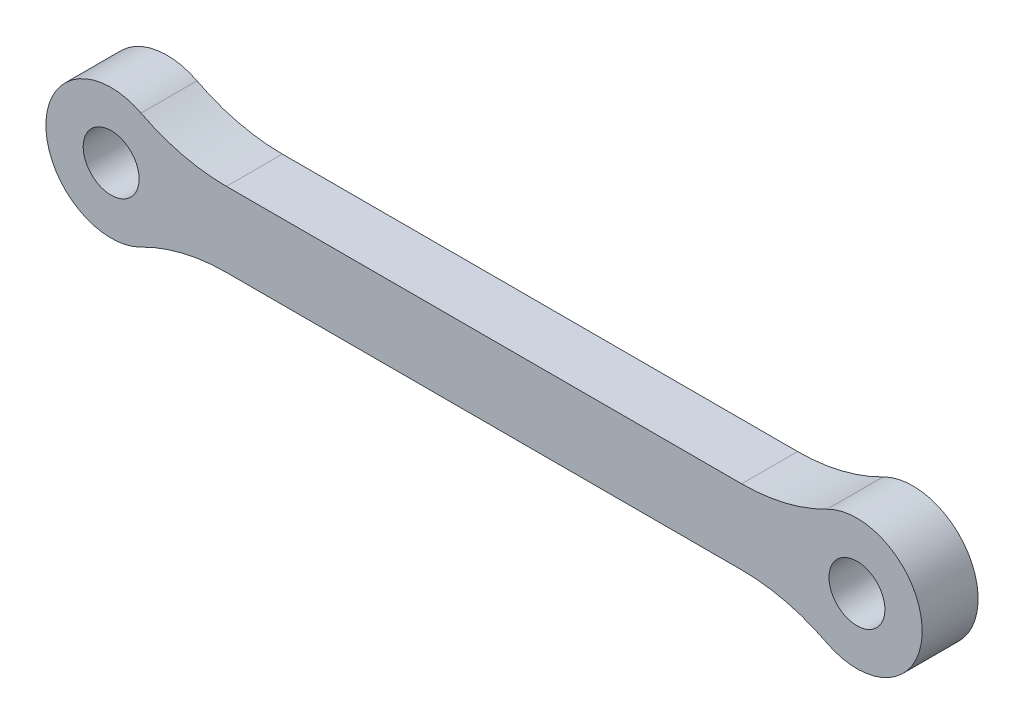
ISO-10303-21;
HEADER;
FILE_DESCRIPTION(('STEP AP214'),'2;1');
FILE_NAME('part.step','',(''),(''),'','','');
FILE_SCHEMA(('AUTOMOTIVE_DESIGN { 1 0 10303 214 1 1 1 1 }'));
ENDSEC;
DATA;
#1=APPLICATION_CONTEXT('core data for automotive mechanical design processes');
#2=APPLICATION_PROTOCOL_DEFINITION('international standard','automotive_design',2000,#1);
#3=PRODUCT_CONTEXT('',#1,'mechanical');
#4=PRODUCT('Part','Part','',(#3));
#5=PRODUCT_RELATED_PRODUCT_CATEGORY('part','',(#4));
#6=PRODUCT_DEFINITION_FORMATION('','',#4);
#7=PRODUCT_DEFINITION_CONTEXT('part definition',#1,'design');
#8=PRODUCT_DEFINITION('design','',#6,#7);
#9=PRODUCT_DEFINITION_SHAPE('','',#8);
#10=(LENGTH_UNIT() NAMED_UNIT(*) SI_UNIT(.MILLI.,.METRE.));
#11=(NAMED_UNIT(*) PLANE_ANGLE_UNIT() SI_UNIT($,.RADIAN.));
#12=(NAMED_UNIT(*) SI_UNIT($,.STERADIAN.) SOLID_ANGLE_UNIT());
#13=UNCERTAINTY_MEASURE_WITH_UNIT(LENGTH_MEASURE(1.E-05),#10,'distance_accuracy_value','');
#14=(GEOMETRIC_REPRESENTATION_CONTEXT(3) GLOBAL_UNCERTAINTY_ASSIGNED_CONTEXT((#13)) GLOBAL_UNIT_ASSIGNED_CONTEXT((#10,
#11,#12)) REPRESENTATION_CONTEXT('',''));
#15=CARTESIAN_POINT('',(0.,0.,0.));
#16=DIRECTION('',(0.,0.,1.));
#17=DIRECTION('',(1.,0.,0.));
#18=AXIS2_PLACEMENT_3D('',#15,#16,#17);
#19=CARTESIAN_POINT('',(-6.18465843842648,12.,3.));
#20=DIRECTION('',(0.,0.,1.));
#21=DIRECTION('',(1.,0.,0.));
#22=AXIS2_PLACEMENT_3D('',#19,#20,#21);
#23=PLANE('',#22);
#24=CARTESIAN_POINT('',(0.,0.,3.));
#25=DIRECTION('',(0.,0.,1.));
#26=DIRECTION('',(1.,0.,0.));
#27=AXIS2_PLACEMENT_3D('',#24,#25,#26);
#28=CIRCLE('',#27,1.5);
#29=CARTESIAN_POINT('',(1.5,0.,3.));
#30=VERTEX_POINT('',#29);
#31=EDGE_CURVE('E148',#30,#30,#28,.T.);
#32=ORIENTED_EDGE('',*,*,#31,.F.);
#33=EDGE_LOOP('',(#32));
#34=FACE_BOUND('',#33,.T.);
#35=CARTESIAN_POINT('',(-6.18465843842648,12.,3.));
#36=DIRECTION('',(0.,0.,-1.));
#37=DIRECTION('',(1.,0.,0.));
#38=AXIS2_PLACEMENT_3D('',#35,#36,#37);
#39=CIRCLE('',#38,10.);
#40=CARTESIAN_POINT('',(-1.60342996551798,3.11111111111111,3.));
#41=VERTEX_POINT('',#40);
#42=CARTESIAN_POINT('',(-6.18465843842648,2.,3.));
#43=VERTEX_POINT('',#42);
#44=EDGE_CURVE('E166',#41,#43,#39,.T.);
#45=ORIENTED_EDGE('',*,*,#44,.T.);
#46=DIRECTION('',(-1.,0.,0.));
#47=VECTOR('',#46,1.);
#48=CARTESIAN_POINT('',(-33.8153415615735,2.,3.));
#49=LINE('',#48,#47);
#50=CARTESIAN_POINT('',(-33.8153415615735,2.,3.));
#51=VERTEX_POINT('',#50);
#52=EDGE_CURVE('E102',#43,#51,#49,.T.);
#53=ORIENTED_EDGE('',*,*,#52,.T.);
#54=CARTESIAN_POINT('',(-33.8153415615735,12.,3.));
#55=DIRECTION('',(0.,0.,-1.));
#56=DIRECTION('',(-1.,0.,0.));
#57=AXIS2_PLACEMENT_3D('',#54,#55,#56);
#58=CIRCLE('',#57,10.);
#59=CARTESIAN_POINT('',(-38.396570034482,3.11111111111111,3.));
#60=VERTEX_POINT('',#59);
#61=EDGE_CURVE('E187',#51,#60,#58,.T.);
#62=ORIENTED_EDGE('',*,*,#61,.T.);
#63=CARTESIAN_POINT('',(-40.,0.,3.));
#64=DIRECTION('',(0.,0.,1.));
#65=DIRECTION('',(-1.,0.,0.));
#66=AXIS2_PLACEMENT_3D('',#63,#64,#65);
#67=CIRCLE('',#66,3.5);
#68=CARTESIAN_POINT('',(-38.396570034482,-3.11111111111112,3.));
#69=VERTEX_POINT('',#68);
#70=EDGE_CURVE('E201',#60,#69,#67,.T.);
#71=ORIENTED_EDGE('',*,*,#70,.T.);
#72=CARTESIAN_POINT('',(-33.8153415615735,-12.,3.));
#73=DIRECTION('',(0.,0.,-1.));
#74=DIRECTION('',(1.,0.,0.));
#75=AXIS2_PLACEMENT_3D('',#72,#73,#74);
#76=CIRCLE('',#75,10.);
#77=CARTESIAN_POINT('',(-33.8153415615735,-2.,3.));
#78=VERTEX_POINT('',#77);
#79=EDGE_CURVE('E121',#69,#78,#76,.T.);
#80=ORIENTED_EDGE('',*,*,#79,.T.);
#81=DIRECTION('',(1.,0.,0.));
#82=VECTOR('',#81,1.);
#83=CARTESIAN_POINT('',(-33.8153415615735,-2.,3.));
#84=LINE('',#83,#82);
#85=CARTESIAN_POINT('',(-6.18465843842648,-2.,3.));
#86=VERTEX_POINT('',#85);
#87=EDGE_CURVE('E115',#78,#86,#84,.T.);
#88=ORIENTED_EDGE('',*,*,#87,.T.);
#89=CARTESIAN_POINT('',(-6.18465843842648,-12.,3.));
#90=DIRECTION('',(0.,0.,-1.));
#91=DIRECTION('',(-1.,0.,0.));
#92=AXIS2_PLACEMENT_3D('',#89,#90,#91);
#93=CIRCLE('',#92,10.);
#94=CARTESIAN_POINT('',(-1.60342996551798,-3.11111111111111,3.));
#95=VERTEX_POINT('',#94);
#96=EDGE_CURVE('E119',#86,#95,#93,.T.);
#97=ORIENTED_EDGE('',*,*,#96,.T.);
#98=CARTESIAN_POINT('',(0.,0.,3.));
#99=DIRECTION('',(0.,0.,1.));
#100=DIRECTION('',(1.,0.,0.));
#101=AXIS2_PLACEMENT_3D('',#98,#99,#100);
#102=CIRCLE('',#101,3.5);
#103=EDGE_CURVE('E59',#95,#41,#102,.T.);
#104=ORIENTED_EDGE('',*,*,#103,.T.);
#105=EDGE_LOOP('',(#45,#53,#62,#71,#80,#88,#97,#104));
#106=FACE_BOUND('',#105,.T.);
#107=CARTESIAN_POINT('',(-40.,0.,3.));
#108=DIRECTION('',(0.,0.,1.));
#109=DIRECTION('',(-1.,0.,0.));
#110=AXIS2_PLACEMENT_3D('',#107,#108,#109);
#111=CIRCLE('',#110,1.5);
#112=CARTESIAN_POINT('',(-41.5,0.,3.));
#113=VERTEX_POINT('',#112);
#114=EDGE_CURVE('E215',#113,#113,#111,.T.);
#115=ORIENTED_EDGE('',*,*,#114,.F.);
#116=EDGE_LOOP('',(#115));
#117=FACE_BOUND('',#116,.T.);
#118=ADVANCED_FACE('F41',(#34,#106,#117),#23,.T.);
#119=CARTESIAN_POINT('',(-6.18465843842648,12.,0.));
#120=DIRECTION('',(0.,0.,1.));
#121=DIRECTION('',(1.,0.,0.));
#122=AXIS2_PLACEMENT_3D('',#119,#120,#121);
#123=PLANE('',#122);
#124=CARTESIAN_POINT('',(-6.18465843842648,12.,0.));
#125=DIRECTION('',(0.,0.,-1.));
#126=DIRECTION('',(1.,0.,0.));
#127=AXIS2_PLACEMENT_3D('',#124,#125,#126);
#128=CIRCLE('',#127,10.);
#129=CARTESIAN_POINT('',(-1.60342996551798,3.11111111111111,0.));
#130=VERTEX_POINT('',#129);
#131=CARTESIAN_POINT('',(-6.18465843842648,2.,0.));
#132=VERTEX_POINT('',#131);
#133=EDGE_CURVE('E143',#130,#132,#128,.T.);
#134=ORIENTED_EDGE('',*,*,#133,.F.);
#135=CARTESIAN_POINT('',(0.,0.,0.));
#136=DIRECTION('',(0.,0.,1.));
#137=DIRECTION('',(1.,0.,0.));
#138=AXIS2_PLACEMENT_3D('',#135,#136,#137);
#139=CIRCLE('',#138,3.5);
#140=CARTESIAN_POINT('',(-1.60342996551798,-3.11111111111111,0.));
#141=VERTEX_POINT('',#140);
#142=EDGE_CURVE('E94',#141,#130,#139,.T.);
#143=ORIENTED_EDGE('',*,*,#142,.F.);
#144=CARTESIAN_POINT('',(-6.18465843842648,-12.,0.));
#145=DIRECTION('',(0.,0.,-1.));
#146=DIRECTION('',(-1.,0.,0.));
#147=AXIS2_PLACEMENT_3D('',#144,#145,#146);
#148=CIRCLE('',#147,10.);
#149=CARTESIAN_POINT('',(-6.18465843842648,-2.,0.));
#150=VERTEX_POINT('',#149);
#151=EDGE_CURVE('E88',#150,#141,#148,.T.);
#152=ORIENTED_EDGE('',*,*,#151,.F.);
#153=DIRECTION('',(1.,0.,0.));
#154=VECTOR('',#153,1.);
#155=CARTESIAN_POINT('',(-33.8153415615735,-2.,0.));
#156=LINE('',#155,#154);
#157=CARTESIAN_POINT('',(-33.8153415615735,-2.,0.));
#158=VERTEX_POINT('',#157);
#159=EDGE_CURVE('E130',#158,#150,#156,.T.);
#160=ORIENTED_EDGE('',*,*,#159,.F.);
#161=CARTESIAN_POINT('',(-33.8153415615735,-12.,0.));
#162=DIRECTION('',(0.,0.,-1.));
#163=DIRECTION('',(1.,0.,0.));
#164=AXIS2_PLACEMENT_3D('',#161,#162,#163);
#165=CIRCLE('',#164,10.);
#166=CARTESIAN_POINT('',(-38.396570034482,-3.11111111111112,0.));
#167=VERTEX_POINT('',#166);
#168=EDGE_CURVE('E157',#167,#158,#165,.T.);
#169=ORIENTED_EDGE('',*,*,#168,.F.);
#170=CARTESIAN_POINT('',(-40.,0.,0.));
#171=DIRECTION('',(0.,0.,1.));
#172=DIRECTION('',(-1.,0.,0.));
#173=AXIS2_PLACEMENT_3D('',#170,#171,#172);
#174=CIRCLE('',#173,3.5);
#175=CARTESIAN_POINT('',(-38.396570034482,3.11111111111111,0.));
#176=VERTEX_POINT('',#175);
#177=EDGE_CURVE('E154',#176,#167,#174,.T.);
#178=ORIENTED_EDGE('',*,*,#177,.F.);
#179=CARTESIAN_POINT('',(-33.8153415615735,12.,0.));
#180=DIRECTION('',(0.,0.,-1.));
#181=DIRECTION('',(-1.,0.,0.));
#182=AXIS2_PLACEMENT_3D('',#179,#180,#181);
#183=CIRCLE('',#182,10.);
#184=CARTESIAN_POINT('',(-33.8153415615735,2.,0.));
#185=VERTEX_POINT('',#184);
#186=EDGE_CURVE('E151',#185,#176,#183,.T.);
#187=ORIENTED_EDGE('',*,*,#186,.F.);
#188=DIRECTION('',(-1.,0.,0.));
#189=VECTOR('',#188,1.);
#190=CARTESIAN_POINT('',(-33.8153415615735,2.,0.));
#191=LINE('',#190,#189);
#192=EDGE_CURVE('E147',#132,#185,#191,.T.);
#193=ORIENTED_EDGE('',*,*,#192,.F.);
#194=EDGE_LOOP('',(#134,#143,#152,#160,#169,#178,#187,#193));
#195=FACE_BOUND('',#194,.T.);
#196=CARTESIAN_POINT('',(0.,0.,0.));
#197=DIRECTION('',(0.,0.,1.));
#198=DIRECTION('',(1.,0.,0.));
#199=AXIS2_PLACEMENT_3D('',#196,#197,#198);
#200=CIRCLE('',#199,1.5);
#201=CARTESIAN_POINT('',(1.5,0.,0.));
#202=VERTEX_POINT('',#201);
#203=EDGE_CURVE('E211',#202,#202,#200,.T.);
#204=ORIENTED_EDGE('',*,*,#203,.T.);
#205=EDGE_LOOP('',(#204));
#206=FACE_BOUND('',#205,.T.);
#207=CARTESIAN_POINT('',(-40.,0.,0.));
#208=DIRECTION('',(0.,0.,1.));
#209=DIRECTION('',(-1.,0.,0.));
#210=AXIS2_PLACEMENT_3D('',#207,#208,#209);
#211=CIRCLE('',#210,1.5);
#212=CARTESIAN_POINT('',(-41.5,0.,0.));
#213=VERTEX_POINT('',#212);
#214=EDGE_CURVE('E219',#213,#213,#211,.T.);
#215=ORIENTED_EDGE('',*,*,#214,.T.);
#216=EDGE_LOOP('',(#215));
#217=FACE_BOUND('',#216,.T.);
#218=ADVANCED_FACE('F191',(#195,#206,#217),#123,.F.);
#219=CARTESIAN_POINT('',(-6.18465843842648,12.,3.));
#220=DIRECTION('',(0.,0.,-1.));
#221=DIRECTION('',(-1.,0.,0.));
#222=AXIS2_PLACEMENT_3D('',#219,#220,#221);
#223=CYLINDRICAL_SURFACE('',#222,10.);
#224=ORIENTED_EDGE('',*,*,#133,.T.);
#225=DIRECTION('',(0.,0.,-1.));
#226=VECTOR('',#225,1.);
#227=CARTESIAN_POINT('',(-6.18465843842648,2.,3.));
#228=LINE('',#227,#226);
#229=EDGE_CURVE('E11',#43,#132,#228,.T.);
#230=ORIENTED_EDGE('',*,*,#229,.F.);
#231=ORIENTED_EDGE('',*,*,#44,.F.);
#232=DIRECTION('',(0.,0.,-1.));
#233=VECTOR('',#232,1.);
#234=CARTESIAN_POINT('',(-1.60342996551798,3.11111111111111,3.));
#235=LINE('',#234,#233);
#236=EDGE_CURVE('E139',#41,#130,#235,.T.);
#237=ORIENTED_EDGE('',*,*,#236,.T.);
#238=EDGE_LOOP('',(#224,#230,#231,#237));
#239=FACE_BOUND('',#238,.T.);
#240=ADVANCED_FACE('F43',(#239),#223,.F.);
#241=CARTESIAN_POINT('',(-33.8153415615735,2.,3.));
#242=DIRECTION('',(0.,-1.,0.));
#243=DIRECTION('',(1.,0.,0.));
#244=AXIS2_PLACEMENT_3D('',#241,#242,#243);
#245=PLANE('',#244);
#246=ORIENTED_EDGE('',*,*,#192,.T.);
#247=DIRECTION('',(0.,0.,-1.));
#248=VECTOR('',#247,1.);
#249=CARTESIAN_POINT('',(-33.8153415615735,2.,3.));
#250=LINE('',#249,#248);
#251=EDGE_CURVE('E51',#51,#185,#250,.T.);
#252=ORIENTED_EDGE('',*,*,#251,.F.);
#253=ORIENTED_EDGE('',*,*,#52,.F.);
#254=ORIENTED_EDGE('',*,*,#229,.T.);
#255=EDGE_LOOP('',(#246,#252,#253,#254));
#256=FACE_BOUND('',#255,.T.);
#257=ADVANCED_FACE('F253',(#256),#245,.F.);
#258=CARTESIAN_POINT('',(-33.8153415615735,12.,3.));
#259=DIRECTION('',(0.,0.,-1.));
#260=DIRECTION('',(-1.,0.,0.));
#261=AXIS2_PLACEMENT_3D('',#258,#259,#260);
#262=CYLINDRICAL_SURFACE('',#261,10.);
#263=ORIENTED_EDGE('',*,*,#186,.T.);
#264=DIRECTION('',(0.,0.,-1.));
#265=VECTOR('',#264,1.);
#266=CARTESIAN_POINT('',(-38.396570034482,3.11111111111111,3.));
#267=LINE('',#266,#265);
#268=EDGE_CURVE('E177',#60,#176,#267,.T.);
#269=ORIENTED_EDGE('',*,*,#268,.F.);
#270=ORIENTED_EDGE('',*,*,#61,.F.);
#271=ORIENTED_EDGE('',*,*,#251,.T.);
#272=EDGE_LOOP('',(#263,#269,#270,#271));
#273=FACE_BOUND('',#272,.T.);
#274=ADVANCED_FACE('F185',(#273),#262,.F.);
#275=CARTESIAN_POINT('',(-40.,0.,3.));
#276=DIRECTION('',(0.,0.,-1.));
#277=DIRECTION('',(-1.,0.,0.));
#278=AXIS2_PLACEMENT_3D('',#275,#276,#277);
#279=CYLINDRICAL_SURFACE('',#278,3.5);
#280=ORIENTED_EDGE('',*,*,#177,.T.);
#281=DIRECTION('',(0.,0.,-1.));
#282=VECTOR('',#281,1.);
#283=CARTESIAN_POINT('',(-38.396570034482,-3.11111111111112,3.));
#284=LINE('',#283,#282);
#285=EDGE_CURVE('E173',#69,#167,#284,.T.);
#286=ORIENTED_EDGE('',*,*,#285,.F.);
#287=ORIENTED_EDGE('',*,*,#70,.F.);
#288=ORIENTED_EDGE('',*,*,#268,.T.);
#289=EDGE_LOOP('',(#280,#286,#287,#288));
#290=FACE_BOUND('',#289,.T.);
#291=ADVANCED_FACE('F196',(#290),#279,.T.);
#292=CARTESIAN_POINT('',(-33.8153415615735,-12.,3.));
#293=DIRECTION('',(0.,0.,-1.));
#294=DIRECTION('',(-1.,0.,0.));
#295=AXIS2_PLACEMENT_3D('',#292,#293,#294);
#296=CYLINDRICAL_SURFACE('',#295,10.);
#297=ORIENTED_EDGE('',*,*,#168,.T.);
#298=DIRECTION('',(0.,0.,-1.));
#299=VECTOR('',#298,1.);
#300=CARTESIAN_POINT('',(-33.8153415615735,-2.,3.));
#301=LINE('',#300,#299);
#302=EDGE_CURVE('E132',#78,#158,#301,.T.);
#303=ORIENTED_EDGE('',*,*,#302,.F.);
#304=ORIENTED_EDGE('',*,*,#79,.F.);
#305=ORIENTED_EDGE('',*,*,#285,.T.);
#306=EDGE_LOOP('',(#297,#303,#304,#305));
#307=FACE_BOUND('',#306,.T.);
#308=ADVANCED_FACE('F199',(#307),#296,.F.);
#309=CARTESIAN_POINT('',(-33.8153415615735,-2.,3.));
#310=DIRECTION('',(0.,1.,0.));
#311=DIRECTION('',(-1.,0.,0.));
#312=AXIS2_PLACEMENT_3D('',#309,#310,#311);
#313=PLANE('',#312);
#314=ORIENTED_EDGE('',*,*,#159,.T.);
#315=DIRECTION('',(0.,0.,-1.));
#316=VECTOR('',#315,1.);
#317=CARTESIAN_POINT('',(-6.18465843842648,-2.,3.));
#318=LINE('',#317,#316);
#319=EDGE_CURVE('E127',#86,#150,#318,.T.);
#320=ORIENTED_EDGE('',*,*,#319,.F.);
#321=ORIENTED_EDGE('',*,*,#87,.F.);
#322=ORIENTED_EDGE('',*,*,#302,.T.);
#323=EDGE_LOOP('',(#314,#320,#321,#322));
#324=FACE_BOUND('',#323,.T.);
#325=ADVANCED_FACE('F128',(#324),#313,.F.);
#326=CARTESIAN_POINT('',(-6.18465843842648,-12.,3.));
#327=DIRECTION('',(0.,0.,-1.));
#328=DIRECTION('',(-1.,0.,0.));
#329=AXIS2_PLACEMENT_3D('',#326,#327,#328);
#330=CYLINDRICAL_SURFACE('',#329,10.);
#331=ORIENTED_EDGE('',*,*,#151,.T.);
#332=DIRECTION('',(0.,0.,-1.));
#333=VECTOR('',#332,1.);
#334=CARTESIAN_POINT('',(-1.60342996551798,-3.11111111111111,3.));
#335=LINE('',#334,#333);
#336=EDGE_CURVE('E133',#95,#141,#335,.T.);
#337=ORIENTED_EDGE('',*,*,#336,.F.);
#338=ORIENTED_EDGE('',*,*,#96,.F.);
#339=ORIENTED_EDGE('',*,*,#319,.T.);
#340=EDGE_LOOP('',(#331,#337,#338,#339));
#341=FACE_BOUND('',#340,.T.);
#342=ADVANCED_FACE('F135',(#341),#330,.F.);
#343=CARTESIAN_POINT('',(0.,0.,3.));
#344=DIRECTION('',(0.,0.,-1.));
#345=DIRECTION('',(-1.,0.,0.));
#346=AXIS2_PLACEMENT_3D('',#343,#344,#345);
#347=CYLINDRICAL_SURFACE('',#346,3.5);
#348=ORIENTED_EDGE('',*,*,#142,.T.);
#349=ORIENTED_EDGE('',*,*,#236,.F.);
#350=ORIENTED_EDGE('',*,*,#103,.F.);
#351=ORIENTED_EDGE('',*,*,#336,.T.);
#352=EDGE_LOOP('',(#348,#349,#350,#351));
#353=FACE_BOUND('',#352,.T.);
#354=ADVANCED_FACE('F241',(#353),#347,.T.);
#355=CARTESIAN_POINT('',(0.,0.,3.));
#356=DIRECTION('',(0.,0.,-1.));
#357=DIRECTION('',(-1.,0.,0.));
#358=AXIS2_PLACEMENT_3D('',#355,#356,#357);
#359=CYLINDRICAL_SURFACE('',#358,1.5);
#360=ORIENTED_EDGE('',*,*,#31,.T.);
#361=EDGE_LOOP('',(#360));
#362=FACE_BOUND('',#361,.T.);
#363=ORIENTED_EDGE('',*,*,#203,.F.);
#364=EDGE_LOOP('',(#363));
#365=FACE_BOUND('',#364,.T.);
#366=ADVANCED_FACE('F238',(#362,#365),#359,.F.);
#367=CARTESIAN_POINT('',(-40.,0.,3.));
#368=DIRECTION('',(0.,0.,-1.));
#369=DIRECTION('',(-1.,0.,0.));
#370=AXIS2_PLACEMENT_3D('',#367,#368,#369);
#371=CYLINDRICAL_SURFACE('',#370,1.5);
#372=ORIENTED_EDGE('',*,*,#114,.T.);
#373=EDGE_LOOP('',(#372));
#374=FACE_BOUND('',#373,.T.);
#375=ORIENTED_EDGE('',*,*,#214,.F.);
#376=EDGE_LOOP('',(#375));
#377=FACE_BOUND('',#376,.T.);
#378=ADVANCED_FACE('F227',(#374,#377),#371,.F.);
#379=CLOSED_SHELL('',(#118,#218,#240,#257,#274,#291,#308,#325,#342,#354,#366,#378));
#380=MANIFOLD_SOLID_BREP('B2',#379);
#381=ADVANCED_BREP_SHAPE_REPRESENTATION('',(#18,#380),#14);
#382=SHAPE_DEFINITION_REPRESENTATION(#9,#381);
ENDSEC;
END-ISO-10303-21;
